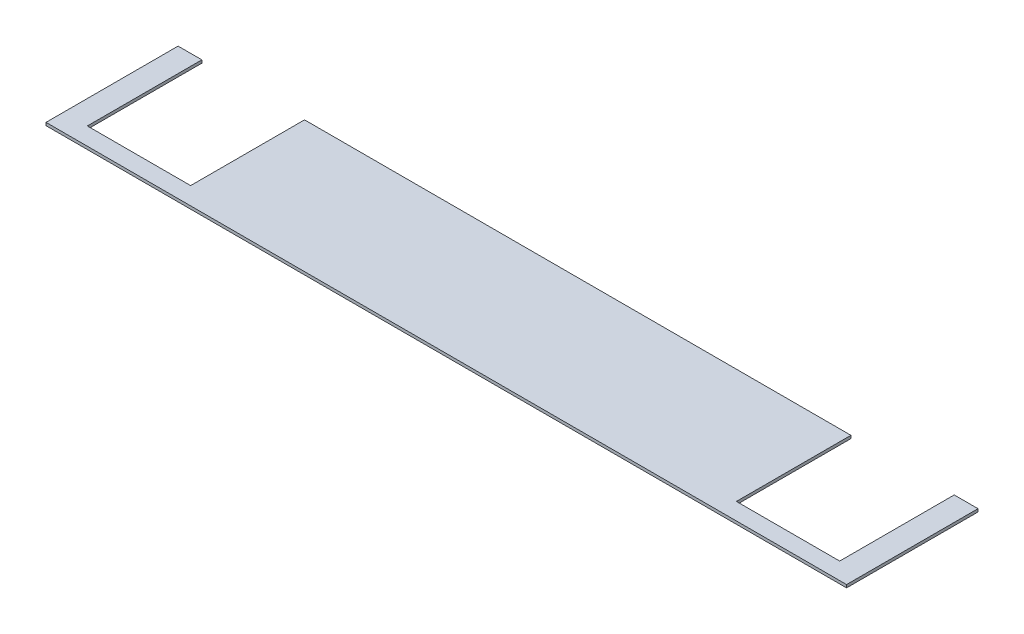
ISO-10303-21;
HEADER;
FILE_DESCRIPTION(('STEP AP214'),'2;1');
FILE_NAME('part.step','',(''),(''),'','','');
FILE_SCHEMA(('AUTOMOTIVE_DESIGN { 1 0 10303 214 1 1 1 1 }'));
ENDSEC;
DATA;
#1=APPLICATION_CONTEXT('core data for automotive mechanical design processes');
#2=APPLICATION_PROTOCOL_DEFINITION('international standard','automotive_design',2000,#1);
#3=PRODUCT_CONTEXT('',#1,'mechanical');
#4=PRODUCT('Part','Part','',(#3));
#5=PRODUCT_RELATED_PRODUCT_CATEGORY('part','',(#4));
#6=PRODUCT_DEFINITION_FORMATION('','',#4);
#7=PRODUCT_DEFINITION_CONTEXT('part definition',#1,'design');
#8=PRODUCT_DEFINITION('design','',#6,#7);
#9=PRODUCT_DEFINITION_SHAPE('','',#8);
#10=(LENGTH_UNIT() NAMED_UNIT(*) SI_UNIT(.MILLI.,.METRE.));
#11=(NAMED_UNIT(*) PLANE_ANGLE_UNIT() SI_UNIT($,.RADIAN.));
#12=(NAMED_UNIT(*) SI_UNIT($,.STERADIAN.) SOLID_ANGLE_UNIT());
#13=UNCERTAINTY_MEASURE_WITH_UNIT(LENGTH_MEASURE(1.E-05),#10,'distance_accuracy_value','');
#14=(GEOMETRIC_REPRESENTATION_CONTEXT(3) GLOBAL_UNCERTAINTY_ASSIGNED_CONTEXT((#13)) GLOBAL_UNIT_ASSIGNED_CONTEXT((#10,
#11,#12)) REPRESENTATION_CONTEXT('',''));
#15=CARTESIAN_POINT('',(0.,0.,0.));
#16=DIRECTION('',(0.,0.,1.));
#17=DIRECTION('',(1.,0.,0.));
#18=AXIS2_PLACEMENT_3D('',#15,#16,#17);
#19=CARTESIAN_POINT('',(-245.520337503118,2.54,-115.491235413454));
#20=DIRECTION('',(1.,0.,0.));
#21=DIRECTION('',(0.,0.,-1.));
#22=AXIS2_PLACEMENT_3D('',#19,#20,#21);
#23=PLANE('',#22);
#24=DIRECTION('',(0.,0.,1.));
#25=VECTOR('',#24,1.);
#26=CARTESIAN_POINT('',(-245.520337503118,0.,-115.491235413454));
#27=LINE('',#26,#25);
#28=CARTESIAN_POINT('',(-245.520337503118,0.,-115.491235413454));
#29=VERTEX_POINT('',#28);
#30=CARTESIAN_POINT('',(-245.520337503118,0.,0.));
#31=VERTEX_POINT('',#30);
#32=EDGE_CURVE('E153',#29,#31,#27,.T.);
#33=ORIENTED_EDGE('',*,*,#32,.T.);
#34=DIRECTION('',(0.,-1.,0.));
#35=VECTOR('',#34,1.);
#36=CARTESIAN_POINT('',(-245.520337503118,2.54,0.));
#37=LINE('',#36,#35);
#38=CARTESIAN_POINT('',(-245.520337503118,2.54,0.));
#39=VERTEX_POINT('',#38);
#40=EDGE_CURVE('E11',#39,#31,#37,.T.);
#41=ORIENTED_EDGE('',*,*,#40,.F.);
#42=DIRECTION('',(0.,0.,1.));
#43=VECTOR('',#42,1.);
#44=CARTESIAN_POINT('',(-245.520337503118,2.54,-115.491235413454));
#45=LINE('',#44,#43);
#46=CARTESIAN_POINT('',(-245.520337503118,2.54,-115.491235413454));
#47=VERTEX_POINT('',#46);
#48=EDGE_CURVE('E175',#47,#39,#45,.T.);
#49=ORIENTED_EDGE('',*,*,#48,.F.);
#50=DIRECTION('',(0.,-1.,0.));
#51=VECTOR('',#50,1.);
#52=CARTESIAN_POINT('',(-245.520337503118,2.54,-115.491235413454));
#53=LINE('',#52,#51);
#54=EDGE_CURVE('E149',#47,#29,#53,.T.);
#55=ORIENTED_EDGE('',*,*,#54,.T.);
#56=EDGE_LOOP('',(#33,#41,#49,#55));
#57=FACE_BOUND('',#56,.T.);
#58=ADVANCED_FACE('F33',(#57),#23,.F.);
#59=CARTESIAN_POINT('',(-245.520337503118,2.54,0.));
#60=DIRECTION('',(0.,0.,-1.));
#61=DIRECTION('',(-1.,0.,0.));
#62=AXIS2_PLACEMENT_3D('',#59,#60,#61);
#63=PLANE('',#62);
#64=DIRECTION('',(1.,0.,0.));
#65=VECTOR('',#64,1.);
#66=CARTESIAN_POINT('',(-245.520337503118,0.,0.));
#67=LINE('',#66,#65);
#68=CARTESIAN_POINT('',(454.479662496882,0.,0.));
#69=VERTEX_POINT('',#68);
#70=EDGE_CURVE('E156',#31,#69,#67,.T.);
#71=ORIENTED_EDGE('',*,*,#70,.T.);
#72=DIRECTION('',(0.,-1.,0.));
#73=VECTOR('',#72,1.);
#74=CARTESIAN_POINT('',(454.479662496882,2.54,0.));
#75=LINE('',#74,#73);
#76=CARTESIAN_POINT('',(454.479662496882,2.54,0.));
#77=VERTEX_POINT('',#76);
#78=EDGE_CURVE('E41',#77,#69,#75,.T.);
#79=ORIENTED_EDGE('',*,*,#78,.F.);
#80=DIRECTION('',(1.,0.,0.));
#81=VECTOR('',#80,1.);
#82=CARTESIAN_POINT('',(-245.520337503118,2.54,0.));
#83=LINE('',#82,#81);
#84=EDGE_CURVE('E104',#39,#77,#83,.T.);
#85=ORIENTED_EDGE('',*,*,#84,.F.);
#86=ORIENTED_EDGE('',*,*,#40,.T.);
#87=EDGE_LOOP('',(#71,#79,#85,#86));
#88=FACE_BOUND('',#87,.T.);
#89=ADVANCED_FACE('F253',(#88),#63,.F.);
#90=CARTESIAN_POINT('',(454.479662496882,2.54,0.));
#91=DIRECTION('',(-1.,0.,0.));
#92=DIRECTION('',(0.,0.,1.));
#93=AXIS2_PLACEMENT_3D('',#90,#91,#92);
#94=PLANE('',#93);
#95=DIRECTION('',(0.,0.,-1.));
#96=VECTOR('',#95,1.);
#97=CARTESIAN_POINT('',(454.479662496882,0.,0.));
#98=LINE('',#97,#96);
#99=CARTESIAN_POINT('',(454.479662496882,0.,-114.93));
#100=VERTEX_POINT('',#99);
#101=EDGE_CURVE('E158',#69,#100,#98,.T.);
#102=ORIENTED_EDGE('',*,*,#101,.T.);
#103=DIRECTION('',(0.,-1.,0.));
#104=VECTOR('',#103,1.);
#105=CARTESIAN_POINT('',(454.479662496882,2.54,-114.93));
#106=LINE('',#105,#104);
#107=CARTESIAN_POINT('',(454.479662496882,2.54,-114.93));
#108=VERTEX_POINT('',#107);
#109=EDGE_CURVE('E194',#108,#100,#106,.T.);
#110=ORIENTED_EDGE('',*,*,#109,.F.);
#111=DIRECTION('',(0.,0.,-1.));
#112=VECTOR('',#111,1.);
#113=CARTESIAN_POINT('',(454.479662496882,2.54,0.));
#114=LINE('',#113,#112);
#115=EDGE_CURVE('E202',#77,#108,#114,.T.);
#116=ORIENTED_EDGE('',*,*,#115,.F.);
#117=ORIENTED_EDGE('',*,*,#78,.T.);
#118=EDGE_LOOP('',(#102,#110,#116,#117));
#119=FACE_BOUND('',#118,.T.);
#120=ADVANCED_FACE('F200',(#119),#94,.F.);
#121=CARTESIAN_POINT('',(454.479662496882,2.54,-114.93));
#122=DIRECTION('',(0.,0.,1.));
#123=DIRECTION('',(1.,0.,0.));
#124=AXIS2_PLACEMENT_3D('',#121,#122,#123);
#125=PLANE('',#124);
#126=DIRECTION('',(-1.,0.,0.));
#127=VECTOR('',#126,1.);
#128=CARTESIAN_POINT('',(454.479662496882,0.,-114.93));
#129=LINE('',#128,#127);
#130=CARTESIAN_POINT('',(433.679662496882,0.,-114.93));
#131=VERTEX_POINT('',#130);
#132=EDGE_CURVE('E160',#100,#131,#129,.T.);
#133=ORIENTED_EDGE('',*,*,#132,.T.);
#134=DIRECTION('',(0.,-1.,0.));
#135=VECTOR('',#134,1.);
#136=CARTESIAN_POINT('',(433.679662496882,2.54,-114.93));
#137=LINE('',#136,#135);
#138=CARTESIAN_POINT('',(433.679662496882,2.54,-114.93));
#139=VERTEX_POINT('',#138);
#140=EDGE_CURVE('E191',#139,#131,#137,.T.);
#141=ORIENTED_EDGE('',*,*,#140,.F.);
#142=DIRECTION('',(-1.,0.,0.));
#143=VECTOR('',#142,1.);
#144=CARTESIAN_POINT('',(454.479662496882,2.54,-114.93));
#145=LINE('',#144,#143);
#146=EDGE_CURVE('E220',#108,#139,#145,.T.);
#147=ORIENTED_EDGE('',*,*,#146,.F.);
#148=ORIENTED_EDGE('',*,*,#109,.T.);
#149=EDGE_LOOP('',(#133,#141,#147,#148));
#150=FACE_BOUND('',#149,.T.);
#151=ADVANCED_FACE('F211',(#150),#125,.F.);
#152=CARTESIAN_POINT('',(433.679662496882,2.54,-114.93));
#153=DIRECTION('',(1.,0.,0.));
#154=DIRECTION('',(0.,0.,-1.));
#155=AXIS2_PLACEMENT_3D('',#152,#153,#154);
#156=PLANE('',#155);
#157=DIRECTION('',(0.,0.,1.));
#158=VECTOR('',#157,1.);
#159=CARTESIAN_POINT('',(433.679662496882,0.,-114.93));
#160=LINE('',#159,#158);
#161=CARTESIAN_POINT('',(433.679662496882,0.,-14.79));
#162=VERTEX_POINT('',#161);
#163=EDGE_CURVE('E162',#131,#162,#160,.T.);
#164=ORIENTED_EDGE('',*,*,#163,.T.);
#165=DIRECTION('',(0.,-1.,0.));
#166=VECTOR('',#165,1.);
#167=CARTESIAN_POINT('',(433.679662496882,2.54,-14.79));
#168=LINE('',#167,#166);
#169=CARTESIAN_POINT('',(433.679662496882,2.54,-14.79));
#170=VERTEX_POINT('',#169);
#171=EDGE_CURVE('E188',#170,#162,#168,.T.);
#172=ORIENTED_EDGE('',*,*,#171,.F.);
#173=DIRECTION('',(0.,0.,1.));
#174=VECTOR('',#173,1.);
#175=CARTESIAN_POINT('',(433.679662496882,2.54,-114.93));
#176=LINE('',#175,#174);
#177=EDGE_CURVE('E217',#139,#170,#176,.T.);
#178=ORIENTED_EDGE('',*,*,#177,.F.);
#179=ORIENTED_EDGE('',*,*,#140,.T.);
#180=EDGE_LOOP('',(#164,#172,#178,#179));
#181=FACE_BOUND('',#180,.T.);
#182=ADVANCED_FACE('F215',(#181),#156,.F.);
#183=CARTESIAN_POINT('',(433.679662496882,2.54,-14.79));
#184=DIRECTION('',(0.,0.,1.));
#185=DIRECTION('',(1.,0.,0.));
#186=AXIS2_PLACEMENT_3D('',#183,#184,#185);
#187=PLANE('',#186);
#188=DIRECTION('',(-1.,0.,0.));
#189=VECTOR('',#188,1.);
#190=CARTESIAN_POINT('',(433.679662496882,0.,-14.79));
#191=LINE('',#190,#189);
#192=CARTESIAN_POINT('',(343.359662496882,0.,-14.79));
#193=VERTEX_POINT('',#192);
#194=EDGE_CURVE('E164',#162,#193,#191,.T.);
#195=ORIENTED_EDGE('',*,*,#194,.T.);
#196=DIRECTION('',(0.,-1.,0.));
#197=VECTOR('',#196,1.);
#198=CARTESIAN_POINT('',(343.359662496882,2.54,-14.79));
#199=LINE('',#198,#197);
#200=CARTESIAN_POINT('',(343.359662496882,2.54,-14.79));
#201=VERTEX_POINT('',#200);
#202=EDGE_CURVE('E185',#201,#193,#199,.T.);
#203=ORIENTED_EDGE('',*,*,#202,.F.);
#204=DIRECTION('',(-1.,0.,0.));
#205=VECTOR('',#204,1.);
#206=CARTESIAN_POINT('',(433.679662496882,2.54,-14.79));
#207=LINE('',#206,#205);
#208=EDGE_CURVE('E219',#170,#201,#207,.T.);
#209=ORIENTED_EDGE('',*,*,#208,.F.);
#210=ORIENTED_EDGE('',*,*,#171,.T.);
#211=EDGE_LOOP('',(#195,#203,#209,#210));
#212=FACE_BOUND('',#211,.T.);
#213=ADVANCED_FACE('F266',(#212),#187,.F.);
#214=CARTESIAN_POINT('',(343.359662496882,2.54,-14.79));
#215=DIRECTION('',(-1.,0.,0.));
#216=DIRECTION('',(0.,0.,1.));
#217=AXIS2_PLACEMENT_3D('',#214,#215,#216);
#218=PLANE('',#217);
#219=DIRECTION('',(0.,0.,-1.));
#220=VECTOR('',#219,1.);
#221=CARTESIAN_POINT('',(343.359662496882,0.,-14.79));
#222=LINE('',#221,#220);
#223=CARTESIAN_POINT('',(343.359662496882,0.,-114.93));
#224=VERTEX_POINT('',#223);
#225=EDGE_CURVE('E166',#193,#224,#222,.T.);
#226=ORIENTED_EDGE('',*,*,#225,.T.);
#227=DIRECTION('',(0.,-1.,0.));
#228=VECTOR('',#227,1.);
#229=CARTESIAN_POINT('',(343.359662496882,2.54,-114.93));
#230=LINE('',#229,#228);
#231=CARTESIAN_POINT('',(343.359662496882,2.54,-114.93));
#232=VERTEX_POINT('',#231);
#233=EDGE_CURVE('E182',#232,#224,#230,.T.);
#234=ORIENTED_EDGE('',*,*,#233,.F.);
#235=DIRECTION('',(0.,0.,-1.));
#236=VECTOR('',#235,1.);
#237=CARTESIAN_POINT('',(343.359662496882,2.54,-14.79));
#238=LINE('',#237,#236);
#239=EDGE_CURVE('E222',#201,#232,#238,.T.);
#240=ORIENTED_EDGE('',*,*,#239,.F.);
#241=ORIENTED_EDGE('',*,*,#202,.T.);
#242=EDGE_LOOP('',(#226,#234,#240,#241));
#243=FACE_BOUND('',#242,.T.);
#244=ADVANCED_FACE('F269',(#243),#218,.F.);
#245=CARTESIAN_POINT('',(343.359662496882,2.54,-114.93));
#246=DIRECTION('',(0.,0.,1.));
#247=DIRECTION('',(1.,0.,0.));
#248=AXIS2_PLACEMENT_3D('',#245,#246,#247);
#249=PLANE('',#248);
#250=DIRECTION('',(-1.,0.,0.));
#251=VECTOR('',#250,1.);
#252=CARTESIAN_POINT('',(343.359662496882,0.,-114.93));
#253=LINE('',#252,#251);
#254=CARTESIAN_POINT('',(-134.400337503118,0.,-114.93));
#255=VERTEX_POINT('',#254);
#256=EDGE_CURVE('E168',#224,#255,#253,.T.);
#257=ORIENTED_EDGE('',*,*,#256,.T.);
#258=DIRECTION('',(0.,-1.,0.));
#259=VECTOR('',#258,1.);
#260=CARTESIAN_POINT('',(-134.400337503118,2.54,-114.93));
#261=LINE('',#260,#259);
#262=CARTESIAN_POINT('',(-134.400337503118,2.54,-114.93));
#263=VERTEX_POINT('',#262);
#264=EDGE_CURVE('E179',#263,#255,#261,.T.);
#265=ORIENTED_EDGE('',*,*,#264,.F.);
#266=DIRECTION('',(-1.,0.,0.));
#267=VECTOR('',#266,1.);
#268=CARTESIAN_POINT('',(343.359662496882,2.54,-114.93));
#269=LINE('',#268,#267);
#270=EDGE_CURVE('E228',#232,#263,#269,.T.);
#271=ORIENTED_EDGE('',*,*,#270,.F.);
#272=ORIENTED_EDGE('',*,*,#233,.T.);
#273=EDGE_LOOP('',(#257,#265,#271,#272));
#274=FACE_BOUND('',#273,.T.);
#275=ADVANCED_FACE('F234',(#274),#249,.F.);
#276=CARTESIAN_POINT('',(-134.400337503118,2.54,-114.93));
#277=DIRECTION('',(1.,0.,0.));
#278=DIRECTION('',(0.,0.,-1.));
#279=AXIS2_PLACEMENT_3D('',#276,#277,#278);
#280=PLANE('',#279);
#281=DIRECTION('',(0.,0.,1.));
#282=VECTOR('',#281,1.);
#283=CARTESIAN_POINT('',(-134.400337503118,0.,-114.93));
#284=LINE('',#283,#282);
#285=CARTESIAN_POINT('',(-134.400337503118,0.,-15.3512354134542));
#286=VERTEX_POINT('',#285);
#287=EDGE_CURVE('E170',#255,#286,#284,.T.);
#288=ORIENTED_EDGE('',*,*,#287,.T.);
#289=DIRECTION('',(0.,-1.,0.));
#290=VECTOR('',#289,1.);
#291=CARTESIAN_POINT('',(-134.400337503118,2.54,-15.3512354134542));
#292=LINE('',#291,#290);
#293=CARTESIAN_POINT('',(-134.400337503118,2.54,-15.3512354134542));
#294=VERTEX_POINT('',#293);
#295=EDGE_CURVE('E144',#294,#286,#292,.T.);
#296=ORIENTED_EDGE('',*,*,#295,.F.);
#297=DIRECTION('',(0.,0.,1.));
#298=VECTOR('',#297,1.);
#299=CARTESIAN_POINT('',(-134.400337503118,2.54,-114.93));
#300=LINE('',#299,#298);
#301=EDGE_CURVE('E135',#263,#294,#300,.T.);
#302=ORIENTED_EDGE('',*,*,#301,.F.);
#303=ORIENTED_EDGE('',*,*,#264,.T.);
#304=EDGE_LOOP('',(#288,#296,#302,#303));
#305=FACE_BOUND('',#304,.T.);
#306=ADVANCED_FACE('F238',(#305),#280,.F.);
#307=CARTESIAN_POINT('',(-134.400337503118,2.54,-15.3512354134542));
#308=DIRECTION('',(0.,0.,1.));
#309=DIRECTION('',(1.,0.,0.));
#310=AXIS2_PLACEMENT_3D('',#307,#308,#309);
#311=PLANE('',#310);
#312=DIRECTION('',(-1.,0.,0.));
#313=VECTOR('',#312,1.);
#314=CARTESIAN_POINT('',(-134.400337503118,0.,-15.3512354134542));
#315=LINE('',#314,#313);
#316=CARTESIAN_POINT('',(-224.720337503118,0.,-15.3512354134542));
#317=VERTEX_POINT('',#316);
#318=EDGE_CURVE('E143',#286,#317,#315,.T.);
#319=ORIENTED_EDGE('',*,*,#318,.T.);
#320=DIRECTION('',(0.,-1.,0.));
#321=VECTOR('',#320,1.);
#322=CARTESIAN_POINT('',(-224.720337503118,2.54,-15.3512354134542));
#323=LINE('',#322,#321);
#324=CARTESIAN_POINT('',(-224.720337503118,2.54,-15.3512354134542));
#325=VERTEX_POINT('',#324);
#326=EDGE_CURVE('E140',#325,#317,#323,.T.);
#327=ORIENTED_EDGE('',*,*,#326,.F.);
#328=DIRECTION('',(-1.,0.,0.));
#329=VECTOR('',#328,1.);
#330=CARTESIAN_POINT('',(-134.400337503118,2.54,-15.3512354134542));
#331=LINE('',#330,#329);
#332=EDGE_CURVE('E129',#294,#325,#331,.T.);
#333=ORIENTED_EDGE('',*,*,#332,.F.);
#334=ORIENTED_EDGE('',*,*,#295,.T.);
#335=EDGE_LOOP('',(#319,#327,#333,#334));
#336=FACE_BOUND('',#335,.T.);
#337=ADVANCED_FACE('F141',(#336),#311,.F.);
#338=CARTESIAN_POINT('',(-224.720337503118,2.54,-15.3512354134542));
#339=DIRECTION('',(-1.,0.,0.));
#340=DIRECTION('',(0.,0.,1.));
#341=AXIS2_PLACEMENT_3D('',#338,#339,#340);
#342=PLANE('',#341);
#343=DIRECTION('',(0.,0.,-1.));
#344=VECTOR('',#343,1.);
#345=CARTESIAN_POINT('',(-224.720337503118,0.,-15.3512354134542));
#346=LINE('',#345,#344);
#347=CARTESIAN_POINT('',(-224.720337503118,0.,-115.491235413454));
#348=VERTEX_POINT('',#347);
#349=EDGE_CURVE('E90',#317,#348,#346,.T.);
#350=ORIENTED_EDGE('',*,*,#349,.T.);
#351=DIRECTION('',(0.,-1.,0.));
#352=VECTOR('',#351,1.);
#353=CARTESIAN_POINT('',(-224.720337503118,2.54,-115.491235413454));
#354=LINE('',#353,#352);
#355=CARTESIAN_POINT('',(-224.720337503118,2.54,-115.491235413454));
#356=VERTEX_POINT('',#355);
#357=EDGE_CURVE('E145',#356,#348,#354,.T.);
#358=ORIENTED_EDGE('',*,*,#357,.F.);
#359=DIRECTION('',(0.,0.,-1.));
#360=VECTOR('',#359,1.);
#361=CARTESIAN_POINT('',(-224.720337503118,2.54,-15.3512354134542));
#362=LINE('',#361,#360);
#363=EDGE_CURVE('E133',#325,#356,#362,.T.);
#364=ORIENTED_EDGE('',*,*,#363,.F.);
#365=ORIENTED_EDGE('',*,*,#326,.T.);
#366=EDGE_LOOP('',(#350,#358,#364,#365));
#367=FACE_BOUND('',#366,.T.);
#368=ADVANCED_FACE('F147',(#367),#342,.F.);
#369=CARTESIAN_POINT('',(-224.720337503118,2.54,-115.491235413454));
#370=DIRECTION('',(0.,0.,1.));
#371=DIRECTION('',(1.,0.,0.));
#372=AXIS2_PLACEMENT_3D('',#369,#370,#371);
#373=PLANE('',#372);
#374=DIRECTION('',(-1.,0.,0.));
#375=VECTOR('',#374,1.);
#376=CARTESIAN_POINT('',(-224.720337503118,0.,-115.491235413454));
#377=LINE('',#376,#375);
#378=EDGE_CURVE('E96',#348,#29,#377,.T.);
#379=ORIENTED_EDGE('',*,*,#378,.T.);
#380=ORIENTED_EDGE('',*,*,#54,.F.);
#381=DIRECTION('',(-1.,0.,0.));
#382=VECTOR('',#381,1.);
#383=CARTESIAN_POINT('',(-224.720337503118,2.54,-115.491235413454));
#384=LINE('',#383,#382);
#385=EDGE_CURVE('E49',#356,#47,#384,.T.);
#386=ORIENTED_EDGE('',*,*,#385,.F.);
#387=ORIENTED_EDGE('',*,*,#357,.T.);
#388=EDGE_LOOP('',(#379,#380,#386,#387));
#389=FACE_BOUND('',#388,.T.);
#390=ADVANCED_FACE('F242',(#389),#373,.F.);
#391=CARTESIAN_POINT('',(0.,2.54,0.));
#392=DIRECTION('',(0.,1.,0.));
#393=DIRECTION('',(0.,0.,1.));
#394=AXIS2_PLACEMENT_3D('',#391,#392,#393);
#395=PLANE('',#394);
#396=ORIENTED_EDGE('',*,*,#48,.T.);
#397=ORIENTED_EDGE('',*,*,#84,.T.);
#398=ORIENTED_EDGE('',*,*,#115,.T.);
#399=ORIENTED_EDGE('',*,*,#146,.T.);
#400=ORIENTED_EDGE('',*,*,#177,.T.);
#401=ORIENTED_EDGE('',*,*,#208,.T.);
#402=ORIENTED_EDGE('',*,*,#239,.T.);
#403=ORIENTED_EDGE('',*,*,#270,.T.);
#404=ORIENTED_EDGE('',*,*,#301,.T.);
#405=ORIENTED_EDGE('',*,*,#332,.T.);
#406=ORIENTED_EDGE('',*,*,#363,.T.);
#407=ORIENTED_EDGE('',*,*,#385,.T.);
#408=EDGE_LOOP('',(#396,#397,#398,#399,#400,#401,#402,#403,#404,#405,#406,#407));
#409=FACE_BOUND('',#408,.T.);
#410=ADVANCED_FACE('F131',(#409),#395,.T.);
#411=CARTESIAN_POINT('',(0.,0.,0.));
#412=DIRECTION('',(0.,1.,0.));
#413=DIRECTION('',(0.,0.,1.));
#414=AXIS2_PLACEMENT_3D('',#411,#412,#413);
#415=PLANE('',#414);
#416=ORIENTED_EDGE('',*,*,#32,.F.);
#417=ORIENTED_EDGE('',*,*,#378,.F.);
#418=ORIENTED_EDGE('',*,*,#349,.F.);
#419=ORIENTED_EDGE('',*,*,#318,.F.);
#420=ORIENTED_EDGE('',*,*,#287,.F.);
#421=ORIENTED_EDGE('',*,*,#256,.F.);
#422=ORIENTED_EDGE('',*,*,#225,.F.);
#423=ORIENTED_EDGE('',*,*,#194,.F.);
#424=ORIENTED_EDGE('',*,*,#163,.F.);
#425=ORIENTED_EDGE('',*,*,#132,.F.);
#426=ORIENTED_EDGE('',*,*,#101,.F.);
#427=ORIENTED_EDGE('',*,*,#70,.F.);
#428=EDGE_LOOP('',(#416,#417,#418,#419,#420,#421,#422,#423,#424,#425,#426,#427));
#429=FACE_BOUND('',#428,.T.);
#430=ADVANCED_FACE('F206',(#429),#415,.F.);
#431=CLOSED_SHELL('',(#58,#89,#120,#151,#182,#213,#244,#275,#306,#337,#368,#390,#410,#430));
#432=MANIFOLD_SOLID_BREP('B2',#431);
#433=ADVANCED_BREP_SHAPE_REPRESENTATION('',(#18,#432),#14);
#434=SHAPE_DEFINITION_REPRESENTATION(#9,#433);
ENDSEC;
END-ISO-10303-21;
